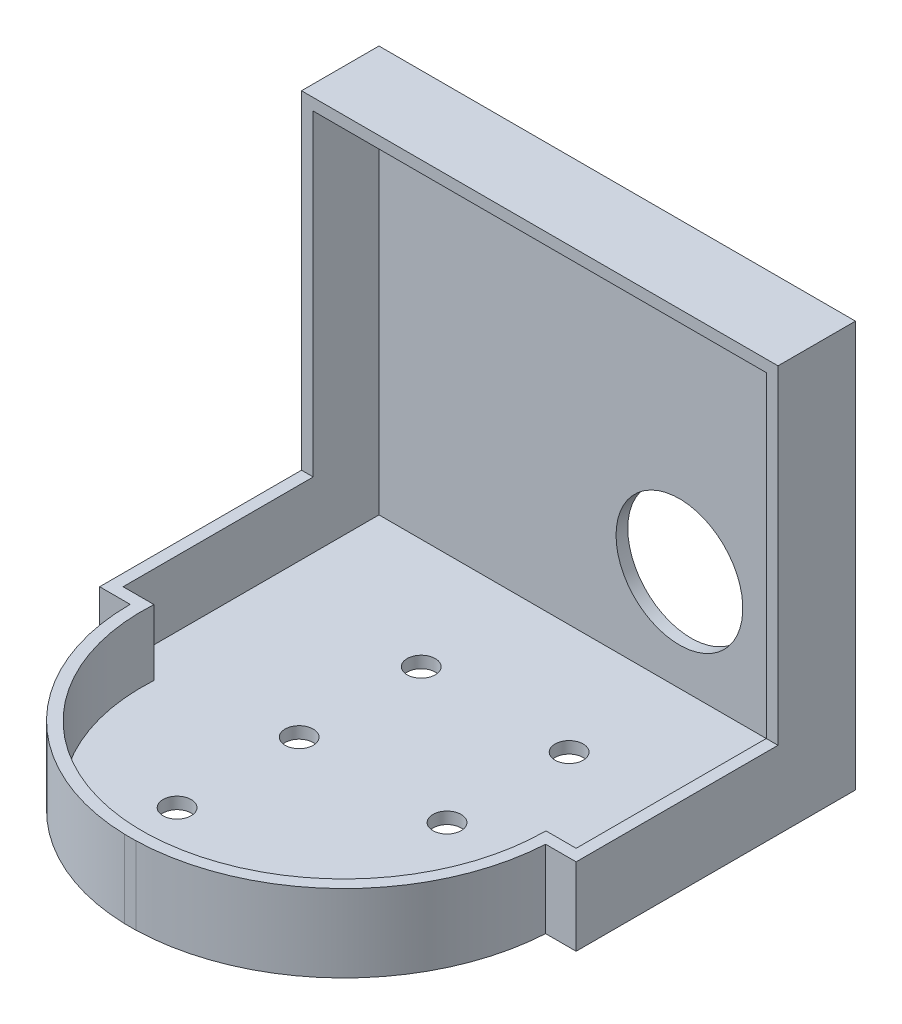
ISO-10303-21;
HEADER;
FILE_DESCRIPTION(('STEP AP214'),'2;1');
FILE_NAME('part.step','',(''),(''),'','','');
FILE_SCHEMA(('AUTOMOTIVE_DESIGN { 1 0 10303 214 1 1 1 1 }'));
ENDSEC;
DATA;
#1=APPLICATION_CONTEXT('core data for automotive mechanical design processes');
#2=APPLICATION_PROTOCOL_DEFINITION('international standard','automotive_design',2000,#1);
#3=PRODUCT_CONTEXT('',#1,'mechanical');
#4=PRODUCT('Part','Part','',(#3));
#5=PRODUCT_RELATED_PRODUCT_CATEGORY('part','',(#4));
#6=PRODUCT_DEFINITION_FORMATION('','',#4);
#7=PRODUCT_DEFINITION_CONTEXT('part definition',#1,'design');
#8=PRODUCT_DEFINITION('design','',#6,#7);
#9=PRODUCT_DEFINITION_SHAPE('','',#8);
#10=(LENGTH_UNIT() NAMED_UNIT(*) SI_UNIT(.MILLI.,.METRE.));
#11=(NAMED_UNIT(*) PLANE_ANGLE_UNIT() SI_UNIT($,.RADIAN.));
#12=(NAMED_UNIT(*) SI_UNIT($,.STERADIAN.) SOLID_ANGLE_UNIT());
#13=UNCERTAINTY_MEASURE_WITH_UNIT(LENGTH_MEASURE(1.E-05),#10,'distance_accuracy_value','');
#14=(GEOMETRIC_REPRESENTATION_CONTEXT(3) GLOBAL_UNCERTAINTY_ASSIGNED_CONTEXT((#13)) GLOBAL_UNIT_ASSIGNED_CONTEXT((#10,
#11,#12)) REPRESENTATION_CONTEXT('',''));
#15=CARTESIAN_POINT('',(0.,0.,0.));
#16=DIRECTION('',(0.,0.,1.));
#17=DIRECTION('',(1.,0.,0.));
#18=AXIS2_PLACEMENT_3D('',#15,#16,#17);
#19=CARTESIAN_POINT('',(109.5,0.,-89.1014851485149));
#20=DIRECTION('',(0.,0.,-1.));
#21=DIRECTION('',(0.,1.,0.));
#22=AXIS2_PLACEMENT_3D('',#19,#20,#21);
#23=PLANE('',#22);
#24=DIRECTION('',(0.,-1.,0.));
#25=VECTOR('',#24,1.);
#26=CARTESIAN_POINT('',(-96.5,0.,-89.1014851485149));
#27=LINE('',#26,#25);
#28=CARTESIAN_POINT('',(-96.5,168.,-89.1014851485149));
#29=VERTEX_POINT('',#28);
#30=CARTESIAN_POINT('',(-96.5,33.,-89.1014851485149));
#31=VERTEX_POINT('',#30);
#32=EDGE_CURVE('E245',#29,#31,#27,.T.);
#33=ORIENTED_EDGE('',*,*,#32,.F.);
#34=DIRECTION('',(-1.,0.,0.));
#35=VECTOR('',#34,1.);
#36=CARTESIAN_POINT('',(0.,168.,-89.1014851485149));
#37=LINE('',#36,#35);
#38=CARTESIAN_POINT('',(96.5,168.,-89.1014851485149));
#39=VERTEX_POINT('',#38);
#40=EDGE_CURVE('E259',#39,#29,#37,.T.);
#41=ORIENTED_EDGE('',*,*,#40,.F.);
#42=DIRECTION('',(0.,-1.,0.));
#43=VECTOR('',#42,1.);
#44=CARTESIAN_POINT('',(96.5,173.,-89.1014851485149));
#45=LINE('',#44,#43);
#46=CARTESIAN_POINT('',(96.5,33.,-89.1014851485149));
#47=VERTEX_POINT('',#46);
#48=EDGE_CURVE('E213',#39,#47,#45,.T.);
#49=ORIENTED_EDGE('',*,*,#48,.T.);
#50=DIRECTION('',(-1.,0.,0.));
#51=VECTOR('',#50,1.);
#52=CARTESIAN_POINT('',(109.5,33.,-89.1014851485149));
#53=LINE('',#52,#51);
#54=CARTESIAN_POINT('',(101.5,33.,-89.1014851485149));
#55=VERTEX_POINT('',#54);
#56=EDGE_CURVE('E353',#55,#47,#53,.T.);
#57=ORIENTED_EDGE('',*,*,#56,.F.);
#58=DIRECTION('',(0.,-1.,0.));
#59=VECTOR('',#58,1.);
#60=CARTESIAN_POINT('',(101.5,173.,-89.1014851485149));
#61=LINE('',#60,#59);
#62=CARTESIAN_POINT('',(101.5,173.,-89.1014851485149));
#63=VERTEX_POINT('',#62);
#64=EDGE_CURVE('E352',#63,#55,#61,.T.);
#65=ORIENTED_EDGE('',*,*,#64,.F.);
#66=DIRECTION('',(-1.,0.,0.));
#67=VECTOR('',#66,1.);
#68=CARTESIAN_POINT('',(0.,173.,-89.1014851485149));
#69=LINE('',#68,#67);
#70=CARTESIAN_POINT('',(-101.5,173.,-89.1014851485149));
#71=VERTEX_POINT('',#70);
#72=EDGE_CURVE('E54',#63,#71,#69,.T.);
#73=ORIENTED_EDGE('',*,*,#72,.T.);
#74=DIRECTION('',(0.,-1.,0.));
#75=VECTOR('',#74,1.);
#76=CARTESIAN_POINT('',(-101.5,0.,-89.1014851485149));
#77=LINE('',#76,#75);
#78=CARTESIAN_POINT('',(-101.5,33.,-89.1014851485149));
#79=VERTEX_POINT('',#78);
#80=EDGE_CURVE('E310',#71,#79,#77,.T.);
#81=ORIENTED_EDGE('',*,*,#80,.T.);
#82=EDGE_CURVE('E347',#31,#79,#53,.T.);
#83=ORIENTED_EDGE('',*,*,#82,.F.);
#84=EDGE_LOOP('',(#33,#41,#49,#57,#65,#73,#81,#83));
#85=FACE_BOUND('',#84,.T.);
#86=ADVANCED_FACE('F45',(#85),#23,.F.);
#87=CARTESIAN_POINT('',(-101.5,173.,-122.101485148515));
#88=DIRECTION('',(1.,0.,0.));
#89=DIRECTION('',(0.,0.,-1.));
#90=AXIS2_PLACEMENT_3D('',#87,#88,#89);
#91=PLANE('',#90);
#92=DIRECTION('',(0.,1.,0.));
#93=VECTOR('',#92,1.);
#94=CARTESIAN_POINT('',(-101.5,0.,-3.10148514851488));
#95=LINE('',#94,#93);
#96=CARTESIAN_POINT('',(-101.5,0.,-3.10148514851488));
#97=VERTEX_POINT('',#96);
#98=CARTESIAN_POINT('',(-101.5,33.,-3.10148514851488));
#99=VERTEX_POINT('',#98);
#100=EDGE_CURVE('E311',#97,#99,#95,.T.);
#101=ORIENTED_EDGE('',*,*,#100,.T.);
#102=DIRECTION('',(0.,0.,1.));
#103=VECTOR('',#102,1.);
#104=CARTESIAN_POINT('',(-101.5,33.,0.));
#105=LINE('',#104,#103);
#106=EDGE_CURVE('E343',#79,#99,#105,.T.);
#107=ORIENTED_EDGE('',*,*,#106,.F.);
#108=ORIENTED_EDGE('',*,*,#80,.F.);
#109=DIRECTION('',(0.,0.,1.));
#110=VECTOR('',#109,1.);
#111=CARTESIAN_POINT('',(-101.5,173.,-122.101485148515));
#112=LINE('',#111,#110);
#113=CARTESIAN_POINT('',(-101.5,173.,-122.101485148515));
#114=VERTEX_POINT('',#113);
#115=EDGE_CURVE('E361',#114,#71,#112,.T.);
#116=ORIENTED_EDGE('',*,*,#115,.F.);
#117=DIRECTION('',(0.,-1.,0.));
#118=VECTOR('',#117,1.);
#119=CARTESIAN_POINT('',(-101.5,173.,-122.101485148515));
#120=LINE('',#119,#118);
#121=CARTESIAN_POINT('',(-101.5,0.,-122.101485148515));
#122=VERTEX_POINT('',#121);
#123=EDGE_CURVE('E372',#114,#122,#120,.T.);
#124=ORIENTED_EDGE('',*,*,#123,.T.);
#125=DIRECTION('',(0.,0.,1.));
#126=VECTOR('',#125,1.);
#127=CARTESIAN_POINT('',(-101.5,0.,-122.101485148515));
#128=LINE('',#127,#126);
#129=EDGE_CURVE('E360',#122,#97,#128,.T.);
#130=ORIENTED_EDGE('',*,*,#129,.T.);
#131=EDGE_LOOP('',(#101,#107,#108,#116,#124,#130));
#132=FACE_BOUND('',#131,.T.);
#133=ADVANCED_FACE('F47',(#132),#91,.F.);
#134=CARTESIAN_POINT('',(-101.5,173.,82.8985148514851));
#135=DIRECTION('',(0.,0.,-1.));
#136=DIRECTION('',(-1.,0.,0.));
#137=AXIS2_PLACEMENT_3D('',#134,#135,#136);
#138=PLANE('',#137);
#139=DIRECTION('',(0.,1.,0.));
#140=VECTOR('',#139,1.);
#141=CARTESIAN_POINT('',(-4.92937853107405,0.,82.8985148514851));
#142=LINE('',#141,#140);
#143=CARTESIAN_POINT('',(-4.92937853107405,0.,82.8985148514851));
#144=VERTEX_POINT('',#143);
#145=CARTESIAN_POINT('',(-4.92937853107405,33.,82.8985148514851));
#146=VERTEX_POINT('',#145);
#147=EDGE_CURVE('E307',#144,#146,#142,.T.);
#148=ORIENTED_EDGE('',*,*,#147,.F.);
#149=DIRECTION('',(1.,0.,0.));
#150=VECTOR('',#149,1.);
#151=CARTESIAN_POINT('',(-101.5,0.,82.8985148514851));
#152=LINE('',#151,#150);
#153=CARTESIAN_POINT('',(0.,0.,82.8985148514851));
#154=VERTEX_POINT('',#153);
#155=EDGE_CURVE('E376',#144,#154,#152,.T.);
#156=ORIENTED_EDGE('',*,*,#155,.T.);
#157=DIRECTION('',(0.,1.,0.));
#158=VECTOR('',#157,1.);
#159=CARTESIAN_POINT('',(0.,0.,82.8985148514851));
#160=LINE('',#159,#158);
#161=CARTESIAN_POINT('',(0.,33.,82.8985148514851));
#162=VERTEX_POINT('',#161);
#163=EDGE_CURVE('E325',#154,#162,#160,.T.);
#164=ORIENTED_EDGE('',*,*,#163,.T.);
#165=DIRECTION('',(-1.,0.,0.));
#166=VECTOR('',#165,1.);
#167=CARTESIAN_POINT('',(109.5,33.,82.8985148514851));
#168=LINE('',#167,#166);
#169=EDGE_CURVE('E348',#162,#146,#168,.T.);
#170=ORIENTED_EDGE('',*,*,#169,.T.);
#171=EDGE_LOOP('',(#148,#156,#164,#170));
#172=FACE_BOUND('',#171,.T.);
#173=ADVANCED_FACE('F422',(#172),#138,.F.);
#174=CARTESIAN_POINT('',(0.,0.,0.));
#175=DIRECTION('',(0.,1.,0.));
#176=DIRECTION('',(0.,0.,1.));
#177=AXIS2_PLACEMENT_3D('',#174,#175,#176);
#178=PLANE('',#177);
#179=CARTESIAN_POINT('',(31.5,0.,-70.1014851485149));
#180=DIRECTION('',(0.,-1.,0.));
#181=DIRECTION('',(0.,0.,-1.));
#182=AXIS2_PLACEMENT_3D('',#179,#180,#181);
#183=CIRCLE('',#182,6.);
#184=CARTESIAN_POINT('',(31.5,0.,-76.1014851485149));
#185=VERTEX_POINT('',#184);
#186=EDGE_CURVE('E460',#185,#185,#183,.T.);
#187=ORIENTED_EDGE('',*,*,#186,.F.);
#188=EDGE_LOOP('',(#187));
#189=FACE_BOUND('',#188,.T.);
#190=CARTESIAN_POINT('',(31.5,0.,33.8985148514851));
#191=DIRECTION('',(0.,-1.,0.));
#192=DIRECTION('',(0.,0.,-1.));
#193=AXIS2_PLACEMENT_3D('',#190,#191,#192);
#194=CIRCLE('',#193,6.);
#195=CARTESIAN_POINT('',(31.5,0.,27.8985148514851));
#196=VERTEX_POINT('',#195);
#197=EDGE_CURVE('E468',#196,#196,#194,.T.);
#198=ORIENTED_EDGE('',*,*,#197,.F.);
#199=EDGE_LOOP('',(#198));
#200=FACE_BOUND('',#199,.T.);
#201=CARTESIAN_POINT('',(31.5,0.,-18.1014851485149));
#202=DIRECTION('',(0.,-1.,0.));
#203=DIRECTION('',(0.,0.,-1.));
#204=AXIS2_PLACEMENT_3D('',#201,#202,#203);
#205=CIRCLE('',#204,6.);
#206=CARTESIAN_POINT('',(31.5,0.,-24.1014851485149));
#207=VERTEX_POINT('',#206);
#208=EDGE_CURVE('E476',#207,#207,#205,.T.);
#209=ORIENTED_EDGE('',*,*,#208,.F.);
#210=EDGE_LOOP('',(#209));
#211=FACE_BOUND('',#210,.T.);
#212=CARTESIAN_POINT('',(-31.5,0.,33.8985148514851));
#213=DIRECTION('',(0.,-1.,0.));
#214=DIRECTION('',(0.,0.,-1.));
#215=AXIS2_PLACEMENT_3D('',#212,#213,#214);
#216=CIRCLE('',#215,6.);
#217=CARTESIAN_POINT('',(-31.5,0.,27.8985148514851));
#218=VERTEX_POINT('',#217);
#219=EDGE_CURVE('E484',#218,#218,#216,.T.);
#220=ORIENTED_EDGE('',*,*,#219,.F.);
#221=EDGE_LOOP('',(#220));
#222=FACE_BOUND('',#221,.T.);
#223=CARTESIAN_POINT('',(-31.5,0.,-18.1014851485149));
#224=DIRECTION('',(0.,-1.,0.));
#225=DIRECTION('',(0.,0.,-1.));
#226=AXIS2_PLACEMENT_3D('',#223,#224,#225);
#227=CIRCLE('',#226,6.);
#228=CARTESIAN_POINT('',(-31.5,0.,-24.1014851485149));
#229=VERTEX_POINT('',#228);
#230=EDGE_CURVE('E452',#229,#229,#227,.T.);
#231=ORIENTED_EDGE('',*,*,#230,.F.);
#232=EDGE_LOOP('',(#231));
#233=FACE_BOUND('',#232,.T.);
#234=CARTESIAN_POINT('',(-31.5,0.,-70.1014851485149));
#235=DIRECTION('',(0.,-1.,0.));
#236=DIRECTION('',(0.,0.,-1.));
#237=AXIS2_PLACEMENT_3D('',#234,#235,#236);
#238=CIRCLE('',#237,6.);
#239=CARTESIAN_POINT('',(-31.5,0.,-76.1014851485149));
#240=VERTEX_POINT('',#239);
#241=EDGE_CURVE('E448',#240,#240,#238,.T.);
#242=ORIENTED_EDGE('',*,*,#241,.F.);
#243=EDGE_LOOP('',(#242));
#244=FACE_BOUND('',#243,.T.);
#245=CARTESIAN_POINT('',(-2.46468926553672,0.,-3.10148514851488));
#246=DIRECTION('',(0.,1.,0.));
#247=DIRECTION('',(0.,0.,1.));
#248=AXIS2_PLACEMENT_3D('',#245,#246,#247);
#249=CIRCLE('',#248,86.0353107344633);
#250=CARTESIAN_POINT('',(-88.5,0.,-3.10148514851488));
#251=VERTEX_POINT('',#250);
#252=EDGE_CURVE('E293',#251,#144,#249,.T.);
#253=ORIENTED_EDGE('',*,*,#252,.F.);
#254=DIRECTION('',(1.,0.,0.));
#255=VECTOR('',#254,1.);
#256=CARTESIAN_POINT('',(0.,0.,-3.10148514851488));
#257=LINE('',#256,#255);
#258=EDGE_CURVE('E296',#97,#251,#257,.T.);
#259=ORIENTED_EDGE('',*,*,#258,.F.);
#260=ORIENTED_EDGE('',*,*,#129,.F.);
#261=DIRECTION('',(-1.,0.,0.));
#262=VECTOR('',#261,1.);
#263=CARTESIAN_POINT('',(-101.5,0.,-122.101485148515));
#264=LINE('',#263,#262);
#265=CARTESIAN_POINT('',(101.5,0.,-122.101485148515));
#266=VERTEX_POINT('',#265);
#267=EDGE_CURVE('E366',#266,#122,#264,.T.);
#268=ORIENTED_EDGE('',*,*,#267,.F.);
#269=DIRECTION('',(0.,0.,-1.));
#270=VECTOR('',#269,1.);
#271=CARTESIAN_POINT('',(101.5,0.,-122.101485148515));
#272=LINE('',#271,#270);
#273=CARTESIAN_POINT('',(101.5,0.,-3.10148514851488));
#274=VERTEX_POINT('',#273);
#275=EDGE_CURVE('E380',#274,#266,#272,.T.);
#276=ORIENTED_EDGE('',*,*,#275,.F.);
#277=DIRECTION('',(-1.,0.,0.));
#278=VECTOR('',#277,1.);
#279=CARTESIAN_POINT('',(0.,0.,-3.10148514851488));
#280=LINE('',#279,#278);
#281=CARTESIAN_POINT('',(88.5,0.,-3.10148514851488));
#282=VERTEX_POINT('',#281);
#283=EDGE_CURVE('E320',#274,#282,#280,.T.);
#284=ORIENTED_EDGE('',*,*,#283,.T.);
#285=CARTESIAN_POINT('',(-2.61448578499275,0.,-8.32831063655978));
#286=DIRECTION('',(0.,1.,0.));
#287=DIRECTION('',(0.,0.,1.));
#288=AXIS2_PLACEMENT_3D('',#285,#286,#287);
#289=CIRCLE('',#288,91.2642823044488);
#290=EDGE_CURVE('E317',#154,#282,#289,.T.);
#291=ORIENTED_EDGE('',*,*,#290,.F.);
#292=ORIENTED_EDGE('',*,*,#155,.F.);
#293=EDGE_LOOP('',(#253,#259,#260,#268,#276,#284,#291,#292));
#294=FACE_BOUND('',#293,.T.);
#295=ADVANCED_FACE('F414',(#189,#200,#211,#222,#233,#244,#294),#178,.F.);
#296=CARTESIAN_POINT('',(109.5,33.,0.));
#297=DIRECTION('',(0.,-1.,0.));
#298=DIRECTION('',(0.,0.,-1.));
#299=AXIS2_PLACEMENT_3D('',#296,#297,#298);
#300=PLANE('',#299);
#301=ORIENTED_EDGE('',*,*,#56,.T.);
#302=DIRECTION('',(0.,0.,1.));
#303=VECTOR('',#302,1.);
#304=CARTESIAN_POINT('',(96.5,33.,-122.101485148515));
#305=LINE('',#304,#303);
#306=CARTESIAN_POINT('',(96.5,33.,-8.10148514851488));
#307=VERTEX_POINT('',#306);
#308=EDGE_CURVE('E61',#47,#307,#305,.T.);
#309=ORIENTED_EDGE('',*,*,#308,.T.);
#310=DIRECTION('',(-1.,0.,0.));
#311=VECTOR('',#310,1.);
#312=CARTESIAN_POINT('',(0.,33.,-8.10148514851488));
#313=LINE('',#312,#311);
#314=CARTESIAN_POINT('',(83.6494983085999,33.,-8.10148514851488));
#315=VERTEX_POINT('',#314);
#316=EDGE_CURVE('E241',#307,#315,#313,.T.);
#317=ORIENTED_EDGE('',*,*,#316,.T.);
#318=CARTESIAN_POINT('',(-2.61448578499275,33.,-8.32831063655978));
#319=DIRECTION('',(0.,-1.,0.));
#320=DIRECTION('',(0.,0.,-1.));
#321=AXIS2_PLACEMENT_3D('',#318,#319,#320);
#322=CIRCLE('',#321,86.2642823044488);
#323=CARTESIAN_POINT('',(-0.0726424074635348,33.,77.8985148514851));
#324=VERTEX_POINT('',#323);
#325=EDGE_CURVE('E278',#324,#315,#322,.F.);
#326=ORIENTED_EDGE('',*,*,#325,.F.);
#327=DIRECTION('',(-1.,0.,0.));
#328=VECTOR('',#327,1.);
#329=CARTESIAN_POINT('',(-101.5,33.,77.8985148514851));
#330=LINE('',#329,#328);
#331=CARTESIAN_POINT('',(-4.85667292581139,33.,77.8985148514851));
#332=VERTEX_POINT('',#331);
#333=EDGE_CURVE('E220',#324,#332,#330,.T.);
#334=ORIENTED_EDGE('',*,*,#333,.T.);
#335=CARTESIAN_POINT('',(-2.46468926553672,33.,-3.10148514851488));
#336=DIRECTION('',(0.,-1.,0.));
#337=DIRECTION('',(0.,0.,-1.));
#338=AXIS2_PLACEMENT_3D('',#335,#336,#337);
#339=CIRCLE('',#338,81.0353107344633);
#340=CARTESIAN_POINT('',(-83.3455991629347,33.,-8.10148514851488));
#341=VERTEX_POINT('',#340);
#342=EDGE_CURVE('E252',#341,#332,#339,.F.);
#343=ORIENTED_EDGE('',*,*,#342,.F.);
#344=DIRECTION('',(1.,0.,0.));
#345=VECTOR('',#344,1.);
#346=CARTESIAN_POINT('',(0.,33.,-8.10148514851488));
#347=LINE('',#346,#345);
#348=CARTESIAN_POINT('',(-96.5,33.,-8.10148514851488));
#349=VERTEX_POINT('',#348);
#350=EDGE_CURVE('E227',#349,#341,#347,.T.);
#351=ORIENTED_EDGE('',*,*,#350,.F.);
#352=DIRECTION('',(0.,0.,1.));
#353=VECTOR('',#352,1.);
#354=CARTESIAN_POINT('',(-96.5,33.,0.));
#355=LINE('',#354,#353);
#356=EDGE_CURVE('E191',#31,#349,#355,.T.);
#357=ORIENTED_EDGE('',*,*,#356,.F.);
#358=ORIENTED_EDGE('',*,*,#82,.T.);
#359=ORIENTED_EDGE('',*,*,#106,.T.);
#360=DIRECTION('',(1.,0.,0.));
#361=VECTOR('',#360,1.);
#362=CARTESIAN_POINT('',(0.,33.,-3.10148514851488));
#363=LINE('',#362,#361);
#364=CARTESIAN_POINT('',(-88.5,33.,-3.10148514851488));
#365=VERTEX_POINT('',#364);
#366=EDGE_CURVE('E297',#99,#365,#363,.T.);
#367=ORIENTED_EDGE('',*,*,#366,.T.);
#368=CARTESIAN_POINT('',(-2.46468926553672,33.,-3.10148514851488));
#369=DIRECTION('',(0.,1.,0.));
#370=DIRECTION('',(0.,0.,1.));
#371=AXIS2_PLACEMENT_3D('',#368,#369,#370);
#372=CIRCLE('',#371,86.0353107344633);
#373=EDGE_CURVE('E69',#365,#146,#372,.T.);
#374=ORIENTED_EDGE('',*,*,#373,.T.);
#375=ORIENTED_EDGE('',*,*,#169,.F.);
#376=CARTESIAN_POINT('',(-2.61448578499275,33.,-8.32831063655978));
#377=DIRECTION('',(0.,1.,0.));
#378=DIRECTION('',(0.,0.,1.));
#379=AXIS2_PLACEMENT_3D('',#376,#377,#378);
#380=CIRCLE('',#379,91.2642823044488);
#381=CARTESIAN_POINT('',(88.5,33.,-3.10148514851488));
#382=VERTEX_POINT('',#381);
#383=EDGE_CURVE('E287',#162,#382,#380,.T.);
#384=ORIENTED_EDGE('',*,*,#383,.T.);
#385=DIRECTION('',(-1.,0.,0.));
#386=VECTOR('',#385,1.);
#387=CARTESIAN_POINT('',(0.,33.,-3.10148514851488));
#388=LINE('',#387,#386);
#389=CARTESIAN_POINT('',(101.5,33.,-3.10148514851488));
#390=VERTEX_POINT('',#389);
#391=EDGE_CURVE('E321',#390,#382,#388,.T.);
#392=ORIENTED_EDGE('',*,*,#391,.F.);
#393=DIRECTION('',(0.,0.,1.));
#394=VECTOR('',#393,1.);
#395=CARTESIAN_POINT('',(101.5,33.,-122.101485148515));
#396=LINE('',#395,#394);
#397=EDGE_CURVE('E11',#55,#390,#396,.T.);
#398=ORIENTED_EDGE('',*,*,#397,.F.);
#399=EDGE_LOOP('',(#301,#309,#317,#326,#334,#343,#351,#357,#358,#359,#367,#374,#375,#384,#392,#398));
#400=FACE_BOUND('',#399,.T.);
#401=ADVANCED_FACE('F433',(#400),#300,.F.);
#402=CARTESIAN_POINT('',(101.5,173.,-122.101485148515));
#403=DIRECTION('',(-1.,0.,0.));
#404=DIRECTION('',(0.,0.,1.));
#405=AXIS2_PLACEMENT_3D('',#402,#403,#404);
#406=PLANE('',#405);
#407=ORIENTED_EDGE('',*,*,#397,.T.);
#408=DIRECTION('',(0.,1.,0.));
#409=VECTOR('',#408,1.);
#410=CARTESIAN_POINT('',(101.5,0.,-3.10148514851488));
#411=LINE('',#410,#409);
#412=EDGE_CURVE('E334',#274,#390,#411,.T.);
#413=ORIENTED_EDGE('',*,*,#412,.F.);
#414=ORIENTED_EDGE('',*,*,#275,.T.);
#415=DIRECTION('',(0.,-1.,0.));
#416=VECTOR('',#415,1.);
#417=CARTESIAN_POINT('',(101.5,173.,-122.101485148515));
#418=LINE('',#417,#416);
#419=CARTESIAN_POINT('',(101.5,173.,-122.101485148515));
#420=VERTEX_POINT('',#419);
#421=EDGE_CURVE('E388',#420,#266,#418,.T.);
#422=ORIENTED_EDGE('',*,*,#421,.F.);
#423=DIRECTION('',(0.,0.,-1.));
#424=VECTOR('',#423,1.);
#425=CARTESIAN_POINT('',(101.5,173.,-122.101485148515));
#426=LINE('',#425,#424);
#427=EDGE_CURVE('E365',#63,#420,#426,.T.);
#428=ORIENTED_EDGE('',*,*,#427,.F.);
#429=ORIENTED_EDGE('',*,*,#64,.T.);
#430=EDGE_LOOP('',(#407,#413,#414,#422,#428,#429));
#431=FACE_BOUND('',#430,.T.);
#432=ADVANCED_FACE('F535',(#431),#406,.F.);
#433=CARTESIAN_POINT('',(-101.5,173.,-122.101485148515));
#434=DIRECTION('',(0.,0.,1.));
#435=DIRECTION('',(1.,0.,0.));
#436=AXIS2_PLACEMENT_3D('',#433,#434,#435);
#437=PLANE('',#436);
#438=CARTESIAN_POINT('',(31.5,48.,-122.101485148515));
#439=DIRECTION('',(0.,0.,-1.));
#440=DIRECTION('',(-1.,0.,0.));
#441=AXIS2_PLACEMENT_3D('',#438,#439,#440);
#442=CIRCLE('',#441,27.);
#443=CARTESIAN_POINT('',(4.5,48.,-122.101485148515));
#444=VERTEX_POINT('',#443);
#445=EDGE_CURVE('E440',#444,#444,#442,.T.);
#446=ORIENTED_EDGE('',*,*,#445,.F.);
#447=EDGE_LOOP('',(#446));
#448=FACE_BOUND('',#447,.T.);
#449=ORIENTED_EDGE('',*,*,#267,.T.);
#450=ORIENTED_EDGE('',*,*,#123,.F.);
#451=DIRECTION('',(-1.,0.,0.));
#452=VECTOR('',#451,1.);
#453=CARTESIAN_POINT('',(-101.5,173.,-122.101485148515));
#454=LINE('',#453,#452);
#455=EDGE_CURVE('E369',#420,#114,#454,.T.);
#456=ORIENTED_EDGE('',*,*,#455,.F.);
#457=ORIENTED_EDGE('',*,*,#421,.T.);
#458=EDGE_LOOP('',(#449,#450,#456,#457));
#459=FACE_BOUND('',#458,.T.);
#460=ADVANCED_FACE('F408',(#448,#459),#437,.F.);
#461=CARTESIAN_POINT('',(0.,173.,0.));
#462=DIRECTION('',(0.,1.,0.));
#463=DIRECTION('',(0.,0.,1.));
#464=AXIS2_PLACEMENT_3D('',#461,#462,#463);
#465=PLANE('',#464);
#466=ORIENTED_EDGE('',*,*,#72,.F.);
#467=ORIENTED_EDGE('',*,*,#427,.T.);
#468=ORIENTED_EDGE('',*,*,#455,.T.);
#469=ORIENTED_EDGE('',*,*,#115,.T.);
#470=EDGE_LOOP('',(#466,#467,#468,#469));
#471=FACE_BOUND('',#470,.T.);
#472=ADVANCED_FACE('F403',(#471),#465,.T.);
#473=CARTESIAN_POINT('',(-2.61448578499275,0.,-8.32831063655978));
#474=DIRECTION('',(0.,1.,0.));
#475=DIRECTION('',(0.,0.,1.));
#476=AXIS2_PLACEMENT_3D('',#473,#474,#475);
#477=CYLINDRICAL_SURFACE('',#476,91.2642823044488);
#478=ORIENTED_EDGE('',*,*,#383,.F.);
#479=ORIENTED_EDGE('',*,*,#163,.F.);
#480=ORIENTED_EDGE('',*,*,#290,.T.);
#481=DIRECTION('',(0.,1.,0.));
#482=VECTOR('',#481,1.);
#483=CARTESIAN_POINT('',(88.5,0.,-3.10148514851488));
#484=LINE('',#483,#482);
#485=EDGE_CURVE('E303',#282,#382,#484,.T.);
#486=ORIENTED_EDGE('',*,*,#485,.T.);
#487=EDGE_LOOP('',(#478,#479,#480,#486));
#488=FACE_BOUND('',#487,.T.);
#489=ADVANCED_FACE('F427',(#488),#477,.T.);
#490=CARTESIAN_POINT('',(0.,0.,-3.10148514851488));
#491=DIRECTION('',(0.,0.,-1.));
#492=DIRECTION('',(-1.,0.,0.));
#493=AXIS2_PLACEMENT_3D('',#490,#491,#492);
#494=PLANE('',#493);
#495=ORIENTED_EDGE('',*,*,#391,.T.);
#496=ORIENTED_EDGE('',*,*,#485,.F.);
#497=ORIENTED_EDGE('',*,*,#283,.F.);
#498=ORIENTED_EDGE('',*,*,#412,.T.);
#499=EDGE_LOOP('',(#495,#496,#497,#498));
#500=FACE_BOUND('',#499,.T.);
#501=ADVANCED_FACE('F429',(#500),#494,.F.);
#502=CARTESIAN_POINT('',(-2.46468926553672,0.,-3.10148514851488));
#503=DIRECTION('',(0.,1.,0.));
#504=DIRECTION('',(0.,0.,1.));
#505=AXIS2_PLACEMENT_3D('',#502,#503,#504);
#506=CYLINDRICAL_SURFACE('',#505,86.0353107344633);
#507=ORIENTED_EDGE('',*,*,#373,.F.);
#508=DIRECTION('',(0.,1.,0.));
#509=VECTOR('',#508,1.);
#510=CARTESIAN_POINT('',(-88.5,0.,-3.10148514851488));
#511=LINE('',#510,#509);
#512=EDGE_CURVE('E300',#251,#365,#511,.T.);
#513=ORIENTED_EDGE('',*,*,#512,.F.);
#514=ORIENTED_EDGE('',*,*,#252,.T.);
#515=ORIENTED_EDGE('',*,*,#147,.T.);
#516=EDGE_LOOP('',(#507,#513,#514,#515));
#517=FACE_BOUND('',#516,.T.);
#518=ADVANCED_FACE('F419',(#517),#506,.T.);
#519=CARTESIAN_POINT('',(0.,0.,-3.10148514851488));
#520=DIRECTION('',(0.,0.,1.));
#521=DIRECTION('',(1.,0.,0.));
#522=AXIS2_PLACEMENT_3D('',#519,#520,#521);
#523=PLANE('',#522);
#524=ORIENTED_EDGE('',*,*,#366,.F.);
#525=ORIENTED_EDGE('',*,*,#100,.F.);
#526=ORIENTED_EDGE('',*,*,#258,.T.);
#527=ORIENTED_EDGE('',*,*,#512,.T.);
#528=EDGE_LOOP('',(#524,#525,#526,#527));
#529=FACE_BOUND('',#528,.T.);
#530=ADVANCED_FACE('F418',(#529),#523,.T.);
#531=CARTESIAN_POINT('',(-96.5,173.,-122.101485148515));
#532=DIRECTION('',(1.,0.,0.));
#533=DIRECTION('',(0.,0.,-1.));
#534=AXIS2_PLACEMENT_3D('',#531,#532,#533);
#535=PLANE('',#534);
#536=DIRECTION('',(0.,1.,0.));
#537=VECTOR('',#536,1.);
#538=CARTESIAN_POINT('',(-96.5,0.,-8.10148514851488));
#539=LINE('',#538,#537);
#540=CARTESIAN_POINT('',(-96.5,5.,-8.10148514851488));
#541=VERTEX_POINT('',#540);
#542=EDGE_CURVE('E184',#541,#349,#539,.T.);
#543=ORIENTED_EDGE('',*,*,#542,.F.);
#544=DIRECTION('',(0.,0.,1.));
#545=VECTOR('',#544,1.);
#546=CARTESIAN_POINT('',(-96.5,5.,-122.101485148515));
#547=LINE('',#546,#545);
#548=CARTESIAN_POINT('',(-96.5,5.,-117.101485148515));
#549=VERTEX_POINT('',#548);
#550=EDGE_CURVE('E189',#549,#541,#547,.T.);
#551=ORIENTED_EDGE('',*,*,#550,.F.);
#552=DIRECTION('',(0.,-1.,0.));
#553=VECTOR('',#552,1.);
#554=CARTESIAN_POINT('',(-96.5,173.,-117.101485148515));
#555=LINE('',#554,#553);
#556=CARTESIAN_POINT('',(-96.5,168.,-117.101485148515));
#557=VERTEX_POINT('',#556);
#558=EDGE_CURVE('E224',#557,#549,#555,.T.);
#559=ORIENTED_EDGE('',*,*,#558,.F.);
#560=DIRECTION('',(0.,0.,1.));
#561=VECTOR('',#560,1.);
#562=CARTESIAN_POINT('',(-96.5,168.,-122.101485148515));
#563=LINE('',#562,#561);
#564=EDGE_CURVE('E231',#557,#29,#563,.T.);
#565=ORIENTED_EDGE('',*,*,#564,.T.);
#566=ORIENTED_EDGE('',*,*,#32,.T.);
#567=ORIENTED_EDGE('',*,*,#356,.T.);
#568=EDGE_LOOP('',(#543,#551,#559,#565,#566,#567));
#569=FACE_BOUND('',#568,.T.);
#570=ADVANCED_FACE('F186',(#569),#535,.T.);
#571=CARTESIAN_POINT('',(-101.5,173.,77.8985148514851));
#572=DIRECTION('',(0.,0.,-1.));
#573=DIRECTION('',(-1.,0.,0.));
#574=AXIS2_PLACEMENT_3D('',#571,#572,#573);
#575=PLANE('',#574);
#576=DIRECTION('',(0.,1.,0.));
#577=VECTOR('',#576,1.);
#578=CARTESIAN_POINT('',(-4.85667292581139,5.,77.8985148514851));
#579=LINE('',#578,#577);
#580=CARTESIAN_POINT('',(-4.85667292581139,5.,77.8985148514851));
#581=VERTEX_POINT('',#580);
#582=EDGE_CURVE('E196',#581,#332,#579,.T.);
#583=ORIENTED_EDGE('',*,*,#582,.T.);
#584=ORIENTED_EDGE('',*,*,#333,.F.);
#585=DIRECTION('',(0.,1.,0.));
#586=VECTOR('',#585,1.);
#587=CARTESIAN_POINT('',(-0.0726424074635651,5.,77.8985148514851));
#588=LINE('',#587,#586);
#589=CARTESIAN_POINT('',(-0.0726424074635651,5.,77.8985148514851));
#590=VERTEX_POINT('',#589);
#591=EDGE_CURVE('E238',#590,#324,#588,.T.);
#592=ORIENTED_EDGE('',*,*,#591,.F.);
#593=DIRECTION('',(1.,0.,0.));
#594=VECTOR('',#593,1.);
#595=CARTESIAN_POINT('',(-101.5,5.,77.8985148514851));
#596=LINE('',#595,#594);
#597=EDGE_CURVE('E212',#581,#590,#596,.T.);
#598=ORIENTED_EDGE('',*,*,#597,.F.);
#599=EDGE_LOOP('',(#583,#584,#592,#598));
#600=FACE_BOUND('',#599,.T.);
#601=ADVANCED_FACE('F592',(#600),#575,.T.);
#602=CARTESIAN_POINT('',(0.,5.,0.));
#603=DIRECTION('',(0.,1.,0.));
#604=DIRECTION('',(0.,0.,1.));
#605=AXIS2_PLACEMENT_3D('',#602,#603,#604);
#606=PLANE('',#605);
#607=CARTESIAN_POINT('',(31.5,5.,-70.1014851485149));
#608=DIRECTION('',(0.,-1.,0.));
#609=DIRECTION('',(0.,0.,-1.));
#610=AXIS2_PLACEMENT_3D('',#607,#608,#609);
#611=CIRCLE('',#610,6.);
#612=CARTESIAN_POINT('',(31.5,5.,-76.1014851485149));
#613=VERTEX_POINT('',#612);
#614=EDGE_CURVE('E456',#613,#613,#611,.T.);
#615=ORIENTED_EDGE('',*,*,#614,.T.);
#616=EDGE_LOOP('',(#615));
#617=FACE_BOUND('',#616,.T.);
#618=CARTESIAN_POINT('',(31.5,5.,33.8985148514851));
#619=DIRECTION('',(0.,-1.,0.));
#620=DIRECTION('',(0.,0.,-1.));
#621=AXIS2_PLACEMENT_3D('',#618,#619,#620);
#622=CIRCLE('',#621,6.);
#623=CARTESIAN_POINT('',(31.5,5.,27.8985148514851));
#624=VERTEX_POINT('',#623);
#625=EDGE_CURVE('E464',#624,#624,#622,.T.);
#626=ORIENTED_EDGE('',*,*,#625,.T.);
#627=EDGE_LOOP('',(#626));
#628=FACE_BOUND('',#627,.T.);
#629=CARTESIAN_POINT('',(31.5,5.,-18.1014851485149));
#630=DIRECTION('',(0.,-1.,0.));
#631=DIRECTION('',(0.,0.,-1.));
#632=AXIS2_PLACEMENT_3D('',#629,#630,#631);
#633=CIRCLE('',#632,6.);
#634=CARTESIAN_POINT('',(31.5,5.,-24.1014851485149));
#635=VERTEX_POINT('',#634);
#636=EDGE_CURVE('E472',#635,#635,#633,.T.);
#637=ORIENTED_EDGE('',*,*,#636,.T.);
#638=EDGE_LOOP('',(#637));
#639=FACE_BOUND('',#638,.T.);
#640=CARTESIAN_POINT('',(-31.5,5.,33.8985148514851));
#641=DIRECTION('',(0.,-1.,0.));
#642=DIRECTION('',(0.,0.,-1.));
#643=AXIS2_PLACEMENT_3D('',#640,#641,#642);
#644=CIRCLE('',#643,6.);
#645=CARTESIAN_POINT('',(-31.5,5.,27.8985148514851));
#646=VERTEX_POINT('',#645);
#647=EDGE_CURVE('E480',#646,#646,#644,.T.);
#648=ORIENTED_EDGE('',*,*,#647,.T.);
#649=EDGE_LOOP('',(#648));
#650=FACE_BOUND('',#649,.T.);
#651=CARTESIAN_POINT('',(-31.5,5.,-18.1014851485149));
#652=DIRECTION('',(0.,-1.,0.));
#653=DIRECTION('',(0.,0.,-1.));
#654=AXIS2_PLACEMENT_3D('',#651,#652,#653);
#655=CIRCLE('',#654,6.);
#656=CARTESIAN_POINT('',(-31.5,5.,-24.1014851485149));
#657=VERTEX_POINT('',#656);
#658=EDGE_CURVE('E488',#657,#657,#655,.T.);
#659=ORIENTED_EDGE('',*,*,#658,.T.);
#660=EDGE_LOOP('',(#659));
#661=FACE_BOUND('',#660,.T.);
#662=CARTESIAN_POINT('',(-31.5,5.,-70.1014851485149));
#663=DIRECTION('',(0.,-1.,0.));
#664=DIRECTION('',(0.,0.,-1.));
#665=AXIS2_PLACEMENT_3D('',#662,#663,#664);
#666=CIRCLE('',#665,6.);
#667=CARTESIAN_POINT('',(-31.5,5.,-76.1014851485149));
#668=VERTEX_POINT('',#667);
#669=EDGE_CURVE('E444',#668,#668,#666,.T.);
#670=ORIENTED_EDGE('',*,*,#669,.T.);
#671=EDGE_LOOP('',(#670));
#672=FACE_BOUND('',#671,.T.);
#673=CARTESIAN_POINT('',(-2.46468926553672,5.,-3.10148514851488));
#674=DIRECTION('',(0.,1.,0.));
#675=DIRECTION('',(0.,0.,1.));
#676=AXIS2_PLACEMENT_3D('',#673,#674,#675);
#677=CIRCLE('',#676,81.0353107344633);
#678=CARTESIAN_POINT('',(-83.3455991629347,5.,-8.10148514851488));
#679=VERTEX_POINT('',#678);
#680=EDGE_CURVE('E205',#679,#581,#677,.T.);
#681=ORIENTED_EDGE('',*,*,#680,.T.);
#682=ORIENTED_EDGE('',*,*,#597,.T.);
#683=CARTESIAN_POINT('',(-2.61448578499275,5.,-8.32831063655978));
#684=DIRECTION('',(0.,1.,0.));
#685=DIRECTION('',(0.,0.,1.));
#686=AXIS2_PLACEMENT_3D('',#683,#684,#685);
#687=CIRCLE('',#686,86.2642823044488);
#688=CARTESIAN_POINT('',(83.6494983085999,5.,-8.10148514851488));
#689=VERTEX_POINT('',#688);
#690=EDGE_CURVE('E239',#590,#689,#687,.T.);
#691=ORIENTED_EDGE('',*,*,#690,.T.);
#692=DIRECTION('',(-1.,0.,0.));
#693=VECTOR('',#692,1.);
#694=CARTESIAN_POINT('',(0.,5.,-8.10148514851488));
#695=LINE('',#694,#693);
#696=CARTESIAN_POINT('',(96.5,5.,-8.10148514851488));
#697=VERTEX_POINT('',#696);
#698=EDGE_CURVE('E234',#697,#689,#695,.T.);
#699=ORIENTED_EDGE('',*,*,#698,.F.);
#700=DIRECTION('',(0.,0.,-1.));
#701=VECTOR('',#700,1.);
#702=CARTESIAN_POINT('',(96.5,5.,-122.101485148515));
#703=LINE('',#702,#701);
#704=CARTESIAN_POINT('',(96.5,5.,-117.101485148515));
#705=VERTEX_POINT('',#704);
#706=EDGE_CURVE('E218',#697,#705,#703,.T.);
#707=ORIENTED_EDGE('',*,*,#706,.T.);
#708=DIRECTION('',(-1.,0.,0.));
#709=VECTOR('',#708,1.);
#710=CARTESIAN_POINT('',(-101.5,5.,-117.101485148515));
#711=LINE('',#710,#709);
#712=EDGE_CURVE('E209',#705,#549,#711,.T.);
#713=ORIENTED_EDGE('',*,*,#712,.T.);
#714=ORIENTED_EDGE('',*,*,#550,.T.);
#715=DIRECTION('',(1.,0.,0.));
#716=VECTOR('',#715,1.);
#717=CARTESIAN_POINT('',(0.,5.,-8.10148514851488));
#718=LINE('',#717,#716);
#719=EDGE_CURVE('E200',#541,#679,#718,.T.);
#720=ORIENTED_EDGE('',*,*,#719,.T.);
#721=EDGE_LOOP('',(#681,#682,#691,#699,#707,#713,#714,#720));
#722=FACE_BOUND('',#721,.T.);
#723=ADVANCED_FACE('F207',(#617,#628,#639,#650,#661,#672,#722),#606,.T.);
#724=CARTESIAN_POINT('',(96.5,173.,-122.101485148515));
#725=DIRECTION('',(-1.,0.,0.));
#726=DIRECTION('',(0.,0.,1.));
#727=AXIS2_PLACEMENT_3D('',#724,#725,#726);
#728=PLANE('',#727);
#729=ORIENTED_EDGE('',*,*,#308,.F.);
#730=ORIENTED_EDGE('',*,*,#48,.F.);
#731=DIRECTION('',(0.,0.,-1.));
#732=VECTOR('',#731,1.);
#733=CARTESIAN_POINT('',(96.5,168.,-122.101485148515));
#734=LINE('',#733,#732);
#735=CARTESIAN_POINT('',(96.5,168.,-117.101485148515));
#736=VERTEX_POINT('',#735);
#737=EDGE_CURVE('E260',#39,#736,#734,.T.);
#738=ORIENTED_EDGE('',*,*,#737,.T.);
#739=DIRECTION('',(0.,-1.,0.));
#740=VECTOR('',#739,1.);
#741=CARTESIAN_POINT('',(96.5,173.,-117.101485148515));
#742=LINE('',#741,#740);
#743=EDGE_CURVE('E255',#736,#705,#742,.T.);
#744=ORIENTED_EDGE('',*,*,#743,.T.);
#745=ORIENTED_EDGE('',*,*,#706,.F.);
#746=DIRECTION('',(0.,1.,0.));
#747=VECTOR('',#746,1.);
#748=CARTESIAN_POINT('',(96.5,0.,-8.10148514851488));
#749=LINE('',#748,#747);
#750=EDGE_CURVE('E248',#697,#307,#749,.T.);
#751=ORIENTED_EDGE('',*,*,#750,.T.);
#752=EDGE_LOOP('',(#729,#730,#738,#744,#745,#751));
#753=FACE_BOUND('',#752,.T.);
#754=ADVANCED_FACE('F610',(#753),#728,.T.);
#755=CARTESIAN_POINT('',(-101.5,173.,-117.101485148515));
#756=DIRECTION('',(0.,0.,1.));
#757=DIRECTION('',(1.,0.,0.));
#758=AXIS2_PLACEMENT_3D('',#755,#756,#757);
#759=PLANE('',#758);
#760=CARTESIAN_POINT('',(31.5,48.,-117.101485148515));
#761=DIRECTION('',(0.,0.,-1.));
#762=DIRECTION('',(-1.,0.,0.));
#763=AXIS2_PLACEMENT_3D('',#760,#761,#762);
#764=CIRCLE('',#763,27.);
#765=CARTESIAN_POINT('',(4.5,48.,-117.101485148515));
#766=VERTEX_POINT('',#765);
#767=EDGE_CURVE('E282',#766,#766,#764,.T.);
#768=ORIENTED_EDGE('',*,*,#767,.T.);
#769=EDGE_LOOP('',(#768));
#770=FACE_BOUND('',#769,.T.);
#771=ORIENTED_EDGE('',*,*,#712,.F.);
#772=ORIENTED_EDGE('',*,*,#743,.F.);
#773=DIRECTION('',(-1.,0.,0.));
#774=VECTOR('',#773,1.);
#775=CARTESIAN_POINT('',(-101.5,168.,-117.101485148515));
#776=LINE('',#775,#774);
#777=EDGE_CURVE('E263',#736,#557,#776,.T.);
#778=ORIENTED_EDGE('',*,*,#777,.T.);
#779=ORIENTED_EDGE('',*,*,#558,.T.);
#780=EDGE_LOOP('',(#771,#772,#778,#779));
#781=FACE_BOUND('',#780,.T.);
#782=ADVANCED_FACE('F619',(#770,#781),#759,.T.);
#783=CARTESIAN_POINT('',(0.,168.,0.));
#784=DIRECTION('',(0.,1.,0.));
#785=DIRECTION('',(0.,0.,1.));
#786=AXIS2_PLACEMENT_3D('',#783,#784,#785);
#787=PLANE('',#786);
#788=ORIENTED_EDGE('',*,*,#40,.T.);
#789=ORIENTED_EDGE('',*,*,#564,.F.);
#790=ORIENTED_EDGE('',*,*,#777,.F.);
#791=ORIENTED_EDGE('',*,*,#737,.F.);
#792=EDGE_LOOP('',(#788,#789,#790,#791));
#793=FACE_BOUND('',#792,.T.);
#794=ADVANCED_FACE('F629',(#793),#787,.F.);
#795=CARTESIAN_POINT('',(-2.61448578499275,0.,-8.32831063655978));
#796=DIRECTION('',(0.,1.,0.));
#797=DIRECTION('',(0.,0.,1.));
#798=AXIS2_PLACEMENT_3D('',#795,#796,#797);
#799=CYLINDRICAL_SURFACE('',#798,86.2642823044488);
#800=ORIENTED_EDGE('',*,*,#325,.T.);
#801=DIRECTION('',(0.,1.,0.));
#802=VECTOR('',#801,1.);
#803=CARTESIAN_POINT('',(83.6494983085999,5.,-8.10148514851488));
#804=LINE('',#803,#802);
#805=EDGE_CURVE('E249',#689,#315,#804,.T.);
#806=ORIENTED_EDGE('',*,*,#805,.F.);
#807=ORIENTED_EDGE('',*,*,#690,.F.);
#808=ORIENTED_EDGE('',*,*,#591,.T.);
#809=EDGE_LOOP('',(#800,#806,#807,#808));
#810=FACE_BOUND('',#809,.T.);
#811=ADVANCED_FACE('F638',(#810),#799,.F.);
#812=CARTESIAN_POINT('',(0.,0.,-8.10148514851488));
#813=DIRECTION('',(0.,0.,-1.));
#814=DIRECTION('',(-1.,0.,0.));
#815=AXIS2_PLACEMENT_3D('',#812,#813,#814);
#816=PLANE('',#815);
#817=ORIENTED_EDGE('',*,*,#316,.F.);
#818=ORIENTED_EDGE('',*,*,#750,.F.);
#819=ORIENTED_EDGE('',*,*,#698,.T.);
#820=ORIENTED_EDGE('',*,*,#805,.T.);
#821=EDGE_LOOP('',(#817,#818,#819,#820));
#822=FACE_BOUND('',#821,.T.);
#823=ADVANCED_FACE('F648',(#822),#816,.T.);
#824=CARTESIAN_POINT('',(-2.46468926553672,0.,-3.10148514851488));
#825=DIRECTION('',(0.,1.,0.));
#826=DIRECTION('',(0.,0.,1.));
#827=AXIS2_PLACEMENT_3D('',#824,#825,#826);
#828=CYLINDRICAL_SURFACE('',#827,81.0353107344633);
#829=ORIENTED_EDGE('',*,*,#342,.T.);
#830=ORIENTED_EDGE('',*,*,#582,.F.);
#831=ORIENTED_EDGE('',*,*,#680,.F.);
#832=DIRECTION('',(0.,1.,0.));
#833=VECTOR('',#832,1.);
#834=CARTESIAN_POINT('',(-83.3455991629347,5.,-8.10148514851488));
#835=LINE('',#834,#833);
#836=EDGE_CURVE('E197',#679,#341,#835,.T.);
#837=ORIENTED_EDGE('',*,*,#836,.T.);
#838=EDGE_LOOP('',(#829,#830,#831,#837));
#839=FACE_BOUND('',#838,.T.);
#840=ADVANCED_FACE('F658',(#839),#828,.F.);
#841=CARTESIAN_POINT('',(0.,0.,-8.10148514851488));
#842=DIRECTION('',(0.,0.,1.));
#843=DIRECTION('',(1.,0.,0.));
#844=AXIS2_PLACEMENT_3D('',#841,#842,#843);
#845=PLANE('',#844);
#846=ORIENTED_EDGE('',*,*,#350,.T.);
#847=ORIENTED_EDGE('',*,*,#836,.F.);
#848=ORIENTED_EDGE('',*,*,#719,.F.);
#849=ORIENTED_EDGE('',*,*,#542,.T.);
#850=EDGE_LOOP('',(#846,#847,#848,#849));
#851=FACE_BOUND('',#850,.T.);
#852=ADVANCED_FACE('F201',(#851),#845,.F.);
#853=CARTESIAN_POINT('',(31.5,48.,-117.101485148515));
#854=DIRECTION('',(0.,0.,-1.));
#855=DIRECTION('',(-1.,0.,0.));
#856=AXIS2_PLACEMENT_3D('',#853,#854,#855);
#857=CYLINDRICAL_SURFACE('',#856,27.);
#858=ORIENTED_EDGE('',*,*,#767,.F.);
#859=EDGE_LOOP('',(#858));
#860=FACE_BOUND('',#859,.T.);
#861=ORIENTED_EDGE('',*,*,#445,.T.);
#862=EDGE_LOOP('',(#861));
#863=FACE_BOUND('',#862,.T.);
#864=ADVANCED_FACE('F506',(#860,#863),#857,.F.);
#865=CARTESIAN_POINT('',(-31.5,5.,-70.1014851485149));
#866=DIRECTION('',(0.,-1.,0.));
#867=DIRECTION('',(0.,0.,-1.));
#868=AXIS2_PLACEMENT_3D('',#865,#866,#867);
#869=CYLINDRICAL_SURFACE('',#868,6.);
#870=ORIENTED_EDGE('',*,*,#669,.F.);
#871=EDGE_LOOP('',(#870));
#872=FACE_BOUND('',#871,.T.);
#873=ORIENTED_EDGE('',*,*,#241,.T.);
#874=EDGE_LOOP('',(#873));
#875=FACE_BOUND('',#874,.T.);
#876=ADVANCED_FACE('F504',(#872,#875),#869,.F.);
#877=CARTESIAN_POINT('',(-31.5,5.,-18.1014851485149));
#878=DIRECTION('',(0.,-1.,0.));
#879=DIRECTION('',(0.,0.,-1.));
#880=AXIS2_PLACEMENT_3D('',#877,#878,#879);
#881=CYLINDRICAL_SURFACE('',#880,6.);
#882=ORIENTED_EDGE('',*,*,#658,.F.);
#883=EDGE_LOOP('',(#882));
#884=FACE_BOUND('',#883,.T.);
#885=ORIENTED_EDGE('',*,*,#230,.T.);
#886=EDGE_LOOP('',(#885));
#887=FACE_BOUND('',#886,.T.);
#888=ADVANCED_FACE('F496',(#884,#887),#881,.F.);
#889=CARTESIAN_POINT('',(-31.5,5.,33.8985148514851));
#890=DIRECTION('',(0.,-1.,0.));
#891=DIRECTION('',(0.,0.,-1.));
#892=AXIS2_PLACEMENT_3D('',#889,#890,#891);
#893=CYLINDRICAL_SURFACE('',#892,6.);
#894=ORIENTED_EDGE('',*,*,#647,.F.);
#895=EDGE_LOOP('',(#894));
#896=FACE_BOUND('',#895,.T.);
#897=ORIENTED_EDGE('',*,*,#219,.T.);
#898=EDGE_LOOP('',(#897));
#899=FACE_BOUND('',#898,.T.);
#900=ADVANCED_FACE('F513',(#896,#899),#893,.F.);
#901=CARTESIAN_POINT('',(31.5,5.,-18.1014851485149));
#902=DIRECTION('',(0.,-1.,0.));
#903=DIRECTION('',(0.,0.,-1.));
#904=AXIS2_PLACEMENT_3D('',#901,#902,#903);
#905=CYLINDRICAL_SURFACE('',#904,6.);
#906=ORIENTED_EDGE('',*,*,#636,.F.);
#907=EDGE_LOOP('',(#906));
#908=FACE_BOUND('',#907,.T.);
#909=ORIENTED_EDGE('',*,*,#208,.T.);
#910=EDGE_LOOP('',(#909));
#911=FACE_BOUND('',#910,.T.);
#912=ADVANCED_FACE('F701',(#908,#911),#905,.F.);
#913=CARTESIAN_POINT('',(31.5,5.,33.8985148514851));
#914=DIRECTION('',(0.,-1.,0.));
#915=DIRECTION('',(0.,0.,-1.));
#916=AXIS2_PLACEMENT_3D('',#913,#914,#915);
#917=CYLINDRICAL_SURFACE('',#916,6.);
#918=ORIENTED_EDGE('',*,*,#625,.F.);
#919=EDGE_LOOP('',(#918));
#920=FACE_BOUND('',#919,.T.);
#921=ORIENTED_EDGE('',*,*,#197,.T.);
#922=EDGE_LOOP('',(#921));
#923=FACE_BOUND('',#922,.T.);
#924=ADVANCED_FACE('F711',(#920,#923),#917,.F.);
#925=CARTESIAN_POINT('',(31.5,5.,-70.1014851485149));
#926=DIRECTION('',(0.,-1.,0.));
#927=DIRECTION('',(0.,0.,-1.));
#928=AXIS2_PLACEMENT_3D('',#925,#926,#927);
#929=CYLINDRICAL_SURFACE('',#928,6.);
#930=ORIENTED_EDGE('',*,*,#614,.F.);
#931=EDGE_LOOP('',(#930));
#932=FACE_BOUND('',#931,.T.);
#933=ORIENTED_EDGE('',*,*,#186,.T.);
#934=EDGE_LOOP('',(#933));
#935=FACE_BOUND('',#934,.T.);
#936=ADVANCED_FACE('F721',(#932,#935),#929,.F.);
#937=CLOSED_SHELL('',(#86,#133,#173,#295,#401,#432,#460,#472,#489,#501,#518,#530,#570,#601,#723,
#754,#782,#794,#811,#823,#840,#852,#864,#876,#888,#900,#912,#924,#936));
#938=MANIFOLD_SOLID_BREP('B2',#937);
#939=ADVANCED_BREP_SHAPE_REPRESENTATION('',(#18,#938),#14);
#940=SHAPE_DEFINITION_REPRESENTATION(#9,#939);
ENDSEC;
END-ISO-10303-21;
